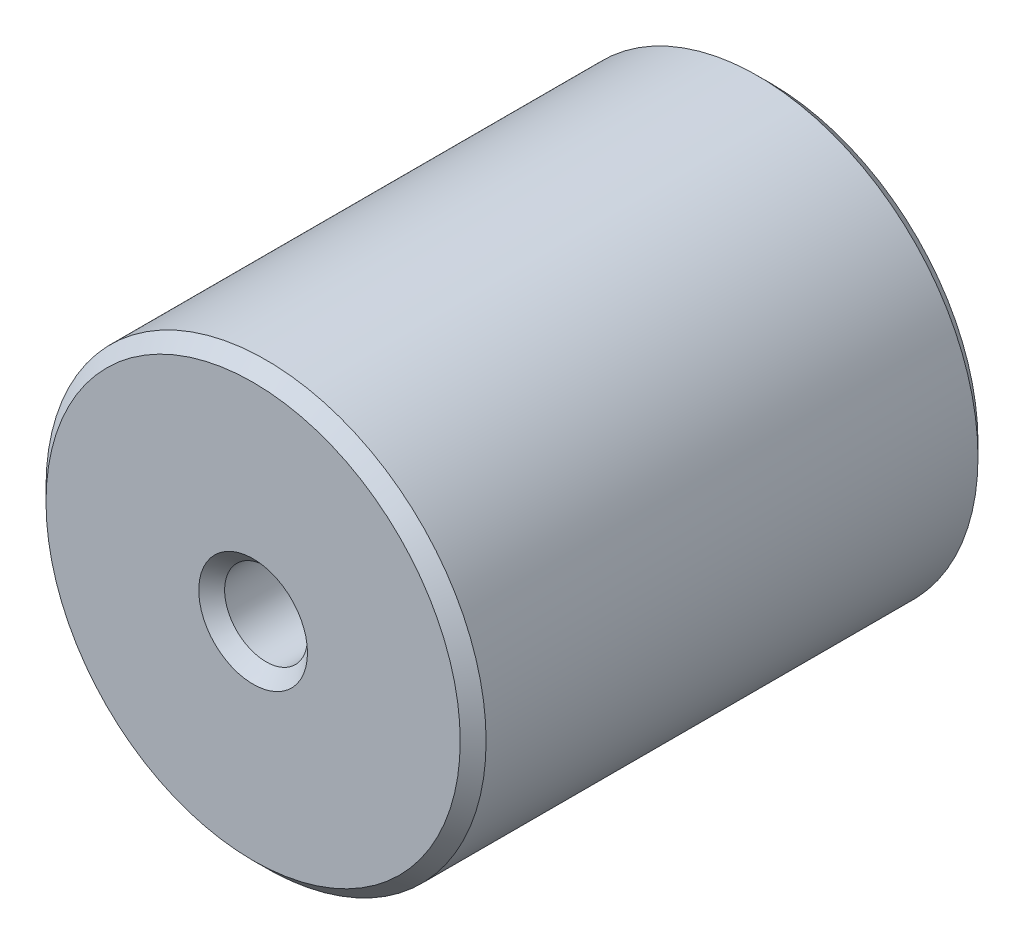
ISO-10303-21;
HEADER;
FILE_DESCRIPTION(('STEP AP214'),'2;1');
FILE_NAME('part.step','',(''),(''),'','','');
FILE_SCHEMA(('AUTOMOTIVE_DESIGN { 1 0 10303 214 1 1 1 1 }'));
ENDSEC;
DATA;
#1=APPLICATION_CONTEXT('core data for automotive mechanical design processes');
#2=APPLICATION_PROTOCOL_DEFINITION('international standard','automotive_design',2000,#1);
#3=PRODUCT_CONTEXT('',#1,'mechanical');
#4=PRODUCT('Part','Part','',(#3));
#5=PRODUCT_RELATED_PRODUCT_CATEGORY('part','',(#4));
#6=PRODUCT_DEFINITION_FORMATION('','',#4);
#7=PRODUCT_DEFINITION_CONTEXT('part definition',#1,'design');
#8=PRODUCT_DEFINITION('design','',#6,#7);
#9=PRODUCT_DEFINITION_SHAPE('','',#8);
#10=(LENGTH_UNIT() NAMED_UNIT(*) SI_UNIT(.MILLI.,.METRE.));
#11=(NAMED_UNIT(*) PLANE_ANGLE_UNIT() SI_UNIT($,.RADIAN.));
#12=(NAMED_UNIT(*) SI_UNIT($,.STERADIAN.) SOLID_ANGLE_UNIT());
#13=UNCERTAINTY_MEASURE_WITH_UNIT(LENGTH_MEASURE(1.E-05),#10,'distance_accuracy_value','');
#14=(GEOMETRIC_REPRESENTATION_CONTEXT(3) GLOBAL_UNCERTAINTY_ASSIGNED_CONTEXT((#13)) GLOBAL_UNIT_ASSIGNED_CONTEXT((#10,
#11,#12)) REPRESENTATION_CONTEXT('',''));
#15=CARTESIAN_POINT('',(0.,0.,0.));
#16=DIRECTION('',(0.,0.,1.));
#17=DIRECTION('',(1.,0.,0.));
#18=AXIS2_PLACEMENT_3D('',#15,#16,#17);
#19=CARTESIAN_POINT('',(0.,0.,40.));
#20=DIRECTION('',(0.,0.,1.));
#21=DIRECTION('',(1.,0.,0.));
#22=AXIS2_PLACEMENT_3D('',#19,#20,#21);
#23=PLANE('',#22);
#24=CARTESIAN_POINT('',(0.,0.,40.));
#25=DIRECTION('',(0.,0.,1.));
#26=DIRECTION('',(1.,0.,0.));
#27=AXIS2_PLACEMENT_3D('',#24,#25,#26);
#28=CIRCLE('',#27,4.20000000000002);
#29=CARTESIAN_POINT('',(4.20000000000002,0.,40.));
#30=VERTEX_POINT('',#29);
#31=EDGE_CURVE('E42',#30,#30,#28,.F.);
#32=ORIENTED_EDGE('',*,*,#31,.T.);
#33=EDGE_LOOP('',(#32));
#34=FACE_BOUND('',#33,.T.);
#35=CARTESIAN_POINT('',(0.,0.,40.));
#36=DIRECTION('',(0.,0.,1.));
#37=DIRECTION('',(1.,0.,0.));
#38=AXIS2_PLACEMENT_3D('',#35,#36,#37);
#39=CIRCLE('',#38,16.);
#40=CARTESIAN_POINT('',(16.,0.,40.));
#41=VERTEX_POINT('',#40);
#42=EDGE_CURVE('E46',#41,#41,#39,.T.);
#43=ORIENTED_EDGE('',*,*,#42,.T.);
#44=EDGE_LOOP('',(#43));
#45=FACE_BOUND('',#44,.T.);
#46=ADVANCED_FACE('F31',(#34,#45),#23,.T.);
#47=CARTESIAN_POINT('',(0.,0.,0.));
#48=DIRECTION('',(0.,0.,1.));
#49=DIRECTION('',(1.,0.,0.));
#50=AXIS2_PLACEMENT_3D('',#47,#48,#49);
#51=PLANE('',#50);
#52=CARTESIAN_POINT('',(0.,0.,0.));
#53=DIRECTION('',(0.,0.,1.));
#54=DIRECTION('',(1.,0.,0.));
#55=AXIS2_PLACEMENT_3D('',#52,#53,#54);
#56=CIRCLE('',#55,4.2);
#57=CARTESIAN_POINT('',(4.2,0.,0.));
#58=VERTEX_POINT('',#57);
#59=EDGE_CURVE('E57',#58,#58,#56,.T.);
#60=ORIENTED_EDGE('',*,*,#59,.T.);
#61=EDGE_LOOP('',(#60));
#62=FACE_BOUND('',#61,.T.);
#63=CARTESIAN_POINT('',(0.,0.,0.));
#64=DIRECTION('',(0.,0.,1.));
#65=DIRECTION('',(1.,0.,0.));
#66=AXIS2_PLACEMENT_3D('',#63,#64,#65);
#67=CIRCLE('',#66,16.);
#68=CARTESIAN_POINT('',(16.,0.,0.));
#69=VERTEX_POINT('',#68);
#70=EDGE_CURVE('E60',#69,#69,#67,.F.);
#71=ORIENTED_EDGE('',*,*,#70,.T.);
#72=EDGE_LOOP('',(#71));
#73=FACE_BOUND('',#72,.T.);
#74=ADVANCED_FACE('F64',(#62,#73),#51,.F.);
#75=CARTESIAN_POINT('',(0.,0.,40.));
#76=DIRECTION('',(0.,0.,-1.));
#77=DIRECTION('',(-1.,0.,0.));
#78=AXIS2_PLACEMENT_3D('',#75,#76,#77);
#79=CYLINDRICAL_SURFACE('',#78,17.);
#80=CARTESIAN_POINT('',(0.,0.,1.00000000000001));
#81=DIRECTION('',(0.,0.,1.));
#82=DIRECTION('',(1.,0.,0.));
#83=AXIS2_PLACEMENT_3D('',#80,#81,#82);
#84=CIRCLE('',#83,17.);
#85=CARTESIAN_POINT('',(17.,0.,1.00000000000001));
#86=VERTEX_POINT('',#85);
#87=EDGE_CURVE('E10',#86,#86,#84,.T.);
#88=ORIENTED_EDGE('',*,*,#87,.T.);
#89=EDGE_LOOP('',(#88));
#90=FACE_BOUND('',#89,.T.);
#91=CARTESIAN_POINT('',(0.,0.,39.));
#92=DIRECTION('',(0.,0.,1.));
#93=DIRECTION('',(1.,0.,0.));
#94=AXIS2_PLACEMENT_3D('',#91,#92,#93);
#95=CIRCLE('',#94,17.);
#96=CARTESIAN_POINT('',(17.,0.,39.));
#97=VERTEX_POINT('',#96);
#98=EDGE_CURVE('E38',#97,#97,#95,.F.);
#99=ORIENTED_EDGE('',*,*,#98,.T.);
#100=EDGE_LOOP('',(#99));
#101=FACE_BOUND('',#100,.T.);
#102=ADVANCED_FACE('F84',(#90,#101),#79,.T.);
#103=CARTESIAN_POINT('',(0.,0.,40.));
#104=DIRECTION('',(0.,0.,-1.));
#105=DIRECTION('',(-1.,0.,0.));
#106=AXIS2_PLACEMENT_3D('',#103,#104,#105);
#107=CYLINDRICAL_SURFACE('',#106,3.2);
#108=CARTESIAN_POINT('',(0.,0.,1.));
#109=DIRECTION('',(0.,0.,1.));
#110=DIRECTION('',(1.,0.,0.));
#111=AXIS2_PLACEMENT_3D('',#108,#109,#110);
#112=CIRCLE('',#111,3.2);
#113=CARTESIAN_POINT('',(3.2,0.,1.));
#114=VERTEX_POINT('',#113);
#115=EDGE_CURVE('E51',#114,#114,#112,.F.);
#116=ORIENTED_EDGE('',*,*,#115,.T.);
#117=EDGE_LOOP('',(#116));
#118=FACE_BOUND('',#117,.T.);
#119=CARTESIAN_POINT('',(0.,0.,39.));
#120=DIRECTION('',(0.,0.,1.));
#121=DIRECTION('',(1.,0.,0.));
#122=AXIS2_PLACEMENT_3D('',#119,#120,#121);
#123=CIRCLE('',#122,3.2);
#124=CARTESIAN_POINT('',(3.2,0.,39.));
#125=VERTEX_POINT('',#124);
#126=EDGE_CURVE('E54',#125,#125,#123,.T.);
#127=ORIENTED_EDGE('',*,*,#126,.T.);
#128=EDGE_LOOP('',(#127));
#129=FACE_BOUND('',#128,.T.);
#130=ADVANCED_FACE('F89',(#118,#129),#107,.F.);
#131=CARTESIAN_POINT('',(0.,0.,0.));
#132=DIRECTION('',(0.,0.,-1.));
#133=DIRECTION('',(-1.,0.,0.));
#134=AXIS2_PLACEMENT_3D('',#131,#132,#133);
#135=CONICAL_SURFACE('',#134,4.2,0.785398163397446);
#136=ORIENTED_EDGE('',*,*,#115,.F.);
#137=EDGE_LOOP('',(#136));
#138=FACE_BOUND('',#137,.T.);
#139=ORIENTED_EDGE('',*,*,#59,.F.);
#140=EDGE_LOOP('',(#139));
#141=FACE_BOUND('',#140,.T.);
#142=ADVANCED_FACE('F75',(#138,#141),#135,.F.);
#143=CARTESIAN_POINT('',(0.,0.,39.));
#144=DIRECTION('',(0.,0.,1.));
#145=DIRECTION('',(1.,0.,0.));
#146=AXIS2_PLACEMENT_3D('',#143,#144,#145);
#147=CONICAL_SURFACE('',#146,3.2,0.785398163397456);
#148=ORIENTED_EDGE('',*,*,#31,.F.);
#149=EDGE_LOOP('',(#148));
#150=FACE_BOUND('',#149,.T.);
#151=ORIENTED_EDGE('',*,*,#126,.F.);
#152=EDGE_LOOP('',(#151));
#153=FACE_BOUND('',#152,.T.);
#154=ADVANCED_FACE('F69',(#150,#153),#147,.F.);
#155=CARTESIAN_POINT('',(0.,0.,1.00000000000001));
#156=DIRECTION('',(0.,0.,1.));
#157=DIRECTION('',(1.,0.,0.));
#158=AXIS2_PLACEMENT_3D('',#155,#156,#157);
#159=CONICAL_SURFACE('',#158,17.,0.785398163397452);
#160=ORIENTED_EDGE('',*,*,#70,.F.);
#161=EDGE_LOOP('',(#160));
#162=FACE_BOUND('',#161,.T.);
#163=ORIENTED_EDGE('',*,*,#87,.F.);
#164=EDGE_LOOP('',(#163));
#165=FACE_BOUND('',#164,.T.);
#166=ADVANCED_FACE('F66',(#162,#165),#159,.T.);
#167=CARTESIAN_POINT('',(0.,0.,40.));
#168=DIRECTION('',(0.,0.,-1.));
#169=DIRECTION('',(-1.,0.,0.));
#170=AXIS2_PLACEMENT_3D('',#167,#168,#169);
#171=CONICAL_SURFACE('',#170,16.,0.785398163397448);
#172=ORIENTED_EDGE('',*,*,#98,.F.);
#173=EDGE_LOOP('',(#172));
#174=FACE_BOUND('',#173,.T.);
#175=ORIENTED_EDGE('',*,*,#42,.F.);
#176=EDGE_LOOP('',(#175));
#177=FACE_BOUND('',#176,.T.);
#178=ADVANCED_FACE('F33',(#174,#177),#171,.T.);
#179=CLOSED_SHELL('',(#46,#74,#102,#130,#142,#154,#166,#178));
#180=MANIFOLD_SOLID_BREP('B2',#179);
#181=ADVANCED_BREP_SHAPE_REPRESENTATION('',(#18,#180),#14);
#182=SHAPE_DEFINITION_REPRESENTATION(#9,#181);
ENDSEC;
END-ISO-10303-21;
